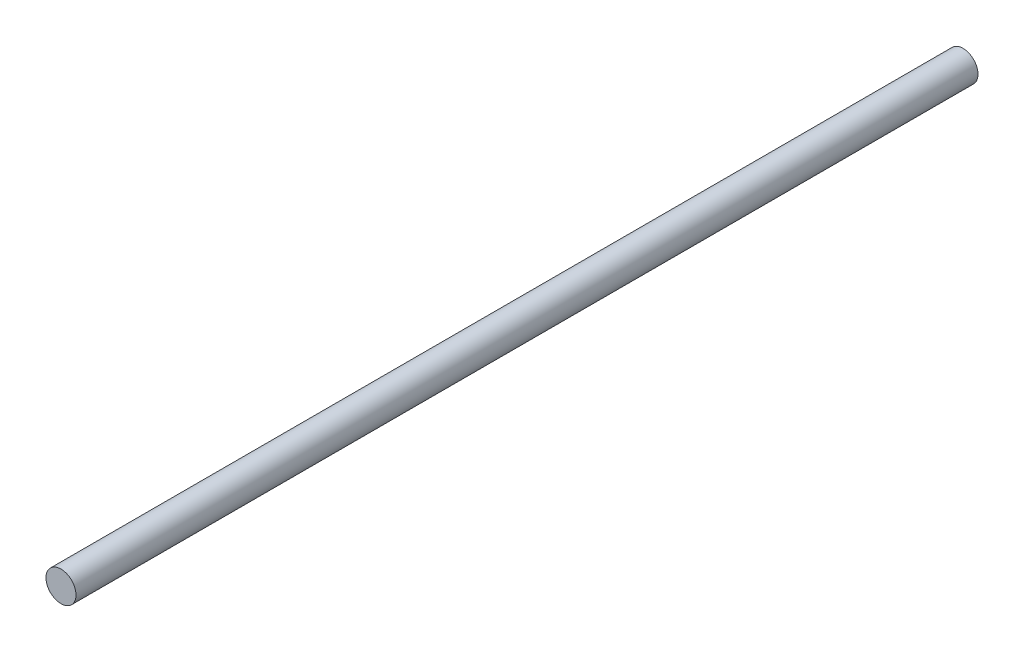
ISO-10303-21;
HEADER;
FILE_DESCRIPTION(('STEP AP214'),'2;1');
FILE_NAME('part.step','',(''),(''),'','','');
FILE_SCHEMA(('AUTOMOTIVE_DESIGN { 1 0 10303 214 1 1 1 1 }'));
ENDSEC;
DATA;
#1=APPLICATION_CONTEXT('core data for automotive mechanical design processes');
#2=APPLICATION_PROTOCOL_DEFINITION('international standard','automotive_design',2000,#1);
#3=PRODUCT_CONTEXT('',#1,'mechanical');
#4=PRODUCT('Part','Part','',(#3));
#5=PRODUCT_RELATED_PRODUCT_CATEGORY('part','',(#4));
#6=PRODUCT_DEFINITION_FORMATION('','',#4);
#7=PRODUCT_DEFINITION_CONTEXT('part definition',#1,'design');
#8=PRODUCT_DEFINITION('design','',#6,#7);
#9=PRODUCT_DEFINITION_SHAPE('','',#8);
#10=(LENGTH_UNIT() NAMED_UNIT(*) SI_UNIT(.MILLI.,.METRE.));
#11=(NAMED_UNIT(*) PLANE_ANGLE_UNIT() SI_UNIT($,.RADIAN.));
#12=(NAMED_UNIT(*) SI_UNIT($,.STERADIAN.) SOLID_ANGLE_UNIT());
#13=UNCERTAINTY_MEASURE_WITH_UNIT(LENGTH_MEASURE(1.E-05),#10,'distance_accuracy_value','');
#14=(GEOMETRIC_REPRESENTATION_CONTEXT(3) GLOBAL_UNCERTAINTY_ASSIGNED_CONTEXT((#13)) GLOBAL_UNIT_ASSIGNED_CONTEXT((#10,
#11,#12)) REPRESENTATION_CONTEXT('',''));
#15=CARTESIAN_POINT('',(0.,0.,0.));
#16=DIRECTION('',(0.,0.,1.));
#17=DIRECTION('',(1.,0.,0.));
#18=AXIS2_PLACEMENT_3D('',#15,#16,#17);
#19=CARTESIAN_POINT('',(1.11022302462516E-13,-2.53269627492614E-13,-300.499999999999));
#20=DIRECTION('',(0.,0.,1.));
#21=DIRECTION('',(1.,0.,0.));
#22=AXIS2_PLACEMENT_3D('',#19,#20,#21);
#23=CYLINDRICAL_SURFACE('',#22,5.);
#24=CARTESIAN_POINT('',(1.11022302462516E-13,-2.53269627492614E-13,-300.499999999999));
#25=DIRECTION('',(0.,0.,1.));
#26=DIRECTION('',(1.,0.,0.));
#27=AXIS2_PLACEMENT_3D('',#24,#25,#26);
#28=CIRCLE('',#27,5.);
#29=CARTESIAN_POINT('',(5.00000000000011,-2.87408985499837E-13,-300.499999999999));
#30=VERTEX_POINT('',#29);
#31=EDGE_CURVE('E10',#30,#30,#28,.T.);
#32=ORIENTED_EDGE('',*,*,#31,.T.);
#33=EDGE_LOOP('',(#32));
#34=FACE_BOUND('',#33,.T.);
#35=CARTESIAN_POINT('',(0.,0.,0.));
#36=DIRECTION('',(0.,0.,1.));
#37=DIRECTION('',(1.,0.,0.));
#38=AXIS2_PLACEMENT_3D('',#35,#36,#37);
#39=CIRCLE('',#38,5.);
#40=CARTESIAN_POINT('',(5.,0.,0.));
#41=VERTEX_POINT('',#40);
#42=EDGE_CURVE('E38',#41,#41,#39,.T.);
#43=ORIENTED_EDGE('',*,*,#42,.F.);
#44=EDGE_LOOP('',(#43));
#45=FACE_BOUND('',#44,.T.);
#46=ADVANCED_FACE('F35',(#34,#45),#23,.T.);
#47=CARTESIAN_POINT('',(1.11022302462516E-13,-2.53269627492614E-13,-300.499999999999));
#48=DIRECTION('',(0.,0.,1.));
#49=DIRECTION('',(1.,0.,0.));
#50=AXIS2_PLACEMENT_3D('',#47,#48,#49);
#51=PLANE('',#50);
#52=ORIENTED_EDGE('',*,*,#31,.F.);
#53=EDGE_LOOP('',(#52));
#54=FACE_BOUND('',#53,.T.);
#55=ADVANCED_FACE('F50',(#54),#51,.F.);
#56=CARTESIAN_POINT('',(0.,0.,0.));
#57=DIRECTION('',(0.,0.,1.));
#58=DIRECTION('',(1.,0.,0.));
#59=AXIS2_PLACEMENT_3D('',#56,#57,#58);
#60=PLANE('',#59);
#61=ORIENTED_EDGE('',*,*,#42,.T.);
#62=EDGE_LOOP('',(#61));
#63=FACE_BOUND('',#62,.T.);
#64=ADVANCED_FACE('F47',(#63),#60,.T.);
#65=CLOSED_SHELL('',(#46,#55,#64));
#66=MANIFOLD_SOLID_BREP('B2',#65);
#67=ADVANCED_BREP_SHAPE_REPRESENTATION('',(#18,#66),#14);
#68=SHAPE_DEFINITION_REPRESENTATION(#9,#67);
ENDSEC;
END-ISO-10303-21;
